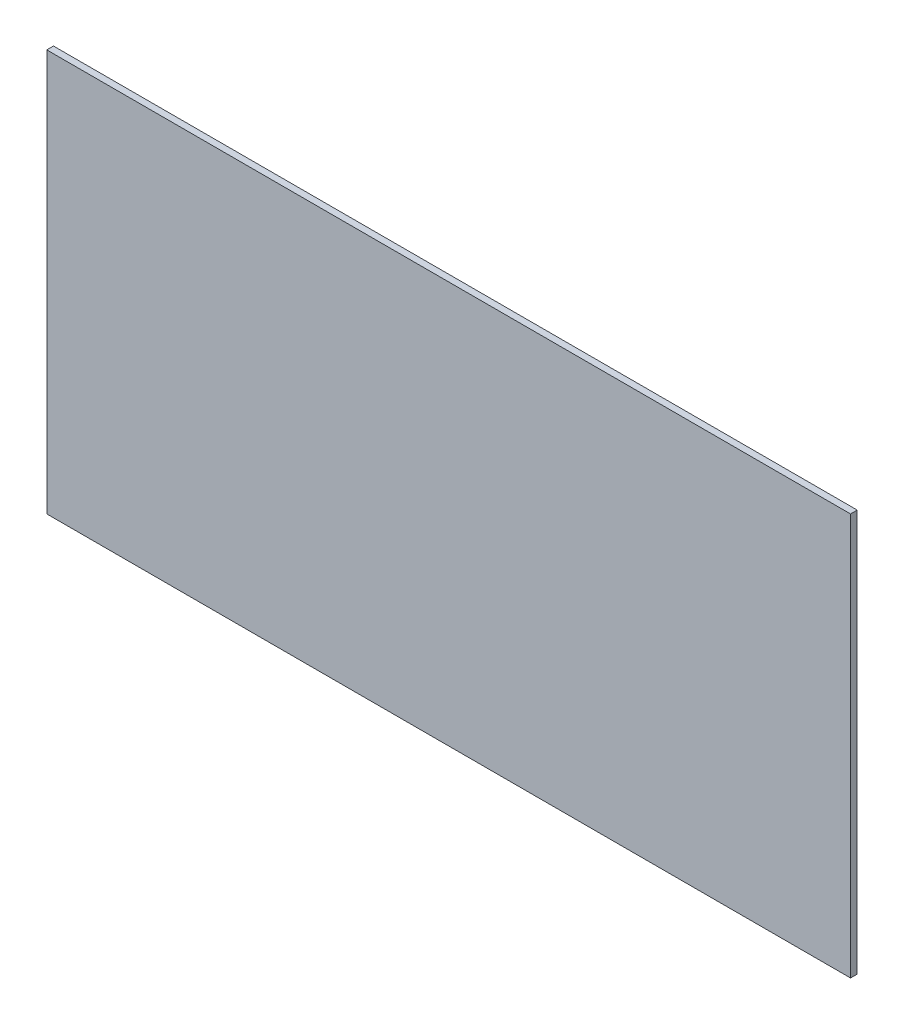
ISO-10303-21;
HEADER;
FILE_DESCRIPTION(('STEP AP214'),'2;1');
FILE_NAME('part.step','',(''),(''),'','','');
FILE_SCHEMA(('AUTOMOTIVE_DESIGN { 1 0 10303 214 1 1 1 1 }'));
ENDSEC;
DATA;
#1=APPLICATION_CONTEXT('core data for automotive mechanical design processes');
#2=APPLICATION_PROTOCOL_DEFINITION('international standard','automotive_design',2000,#1);
#3=PRODUCT_CONTEXT('',#1,'mechanical');
#4=PRODUCT('Part','Part','',(#3));
#5=PRODUCT_RELATED_PRODUCT_CATEGORY('part','',(#4));
#6=PRODUCT_DEFINITION_FORMATION('','',#4);
#7=PRODUCT_DEFINITION_CONTEXT('part definition',#1,'design');
#8=PRODUCT_DEFINITION('design','',#6,#7);
#9=PRODUCT_DEFINITION_SHAPE('','',#8);
#10=(LENGTH_UNIT() NAMED_UNIT(*) SI_UNIT(.MILLI.,.METRE.));
#11=(NAMED_UNIT(*) PLANE_ANGLE_UNIT() SI_UNIT($,.RADIAN.));
#12=(NAMED_UNIT(*) SI_UNIT($,.STERADIAN.) SOLID_ANGLE_UNIT());
#13=UNCERTAINTY_MEASURE_WITH_UNIT(LENGTH_MEASURE(1.E-05),#10,'distance_accuracy_value','');
#14=(GEOMETRIC_REPRESENTATION_CONTEXT(3) GLOBAL_UNCERTAINTY_ASSIGNED_CONTEXT((#13)) GLOBAL_UNIT_ASSIGNED_CONTEXT((#10,
#11,#12)) REPRESENTATION_CONTEXT('',''));
#15=CARTESIAN_POINT('',(0.,0.,0.));
#16=DIRECTION('',(0.,0.,1.));
#17=DIRECTION('',(1.,0.,0.));
#18=AXIS2_PLACEMENT_3D('',#15,#16,#17);
#19=CARTESIAN_POINT('',(304.8,0.,2.54));
#20=DIRECTION('',(0.,1.,0.));
#21=DIRECTION('',(0.,0.,1.));
#22=AXIS2_PLACEMENT_3D('',#19,#20,#21);
#23=PLANE('',#22);
#24=DIRECTION('',(1.,0.,0.));
#25=VECTOR('',#24,1.);
#26=CARTESIAN_POINT('',(304.8,0.,0.));
#27=LINE('',#26,#25);
#28=CARTESIAN_POINT('',(0.,0.,0.));
#29=VERTEX_POINT('',#28);
#30=CARTESIAN_POINT('',(304.8,0.,0.));
#31=VERTEX_POINT('',#30);
#32=EDGE_CURVE('E107',#29,#31,#27,.T.);
#33=ORIENTED_EDGE('',*,*,#32,.T.);
#34=DIRECTION('',(0.,0.,-1.));
#35=VECTOR('',#34,1.);
#36=CARTESIAN_POINT('',(304.8,0.,2.54));
#37=LINE('',#36,#35);
#38=CARTESIAN_POINT('',(304.8,0.,2.54));
#39=VERTEX_POINT('',#38);
#40=EDGE_CURVE('E11',#39,#31,#37,.T.);
#41=ORIENTED_EDGE('',*,*,#40,.F.);
#42=DIRECTION('',(1.,0.,0.));
#43=VECTOR('',#42,1.);
#44=CARTESIAN_POINT('',(304.8,0.,2.54));
#45=LINE('',#44,#43);
#46=CARTESIAN_POINT('',(0.,0.,2.54));
#47=VERTEX_POINT('',#46);
#48=EDGE_CURVE('E91',#47,#39,#45,.T.);
#49=ORIENTED_EDGE('',*,*,#48,.F.);
#50=DIRECTION('',(0.,0.,-1.));
#51=VECTOR('',#50,1.);
#52=CARTESIAN_POINT('',(0.,0.,2.54));
#53=LINE('',#52,#51);
#54=EDGE_CURVE('E103',#47,#29,#53,.T.);
#55=ORIENTED_EDGE('',*,*,#54,.T.);
#56=EDGE_LOOP('',(#33,#41,#49,#55));
#57=FACE_BOUND('',#56,.T.);
#58=ADVANCED_FACE('F39',(#57),#23,.F.);
#59=CARTESIAN_POINT('',(304.8,152.4,2.54));
#60=DIRECTION('',(-1.,0.,0.));
#61=DIRECTION('',(0.,0.,1.));
#62=AXIS2_PLACEMENT_3D('',#59,#60,#61);
#63=PLANE('',#62);
#64=DIRECTION('',(0.,1.,0.));
#65=VECTOR('',#64,1.);
#66=CARTESIAN_POINT('',(304.8,152.4,0.));
#67=LINE('',#66,#65);
#68=CARTESIAN_POINT('',(304.8,152.4,0.));
#69=VERTEX_POINT('',#68);
#70=EDGE_CURVE('E96',#31,#69,#67,.T.);
#71=ORIENTED_EDGE('',*,*,#70,.T.);
#72=DIRECTION('',(0.,0.,-1.));
#73=VECTOR('',#72,1.);
#74=CARTESIAN_POINT('',(304.8,152.4,2.54));
#75=LINE('',#74,#73);
#76=CARTESIAN_POINT('',(304.8,152.4,2.54));
#77=VERTEX_POINT('',#76);
#78=EDGE_CURVE('E48',#77,#69,#75,.T.);
#79=ORIENTED_EDGE('',*,*,#78,.F.);
#80=DIRECTION('',(0.,1.,0.));
#81=VECTOR('',#80,1.);
#82=CARTESIAN_POINT('',(304.8,152.4,2.54));
#83=LINE('',#82,#81);
#84=EDGE_CURVE('E86',#39,#77,#83,.T.);
#85=ORIENTED_EDGE('',*,*,#84,.F.);
#86=ORIENTED_EDGE('',*,*,#40,.T.);
#87=EDGE_LOOP('',(#71,#79,#85,#86));
#88=FACE_BOUND('',#87,.T.);
#89=ADVANCED_FACE('F95',(#88),#63,.F.);
#90=CARTESIAN_POINT('',(0.,152.4,2.54));
#91=DIRECTION('',(0.,-1.,0.));
#92=DIRECTION('',(0.,0.,-1.));
#93=AXIS2_PLACEMENT_3D('',#90,#91,#92);
#94=PLANE('',#93);
#95=DIRECTION('',(-1.,0.,0.));
#96=VECTOR('',#95,1.);
#97=CARTESIAN_POINT('',(0.,152.4,0.));
#98=LINE('',#97,#96);
#99=CARTESIAN_POINT('',(0.,152.4,0.));
#100=VERTEX_POINT('',#99);
#101=EDGE_CURVE('E73',#69,#100,#98,.T.);
#102=ORIENTED_EDGE('',*,*,#101,.T.);
#103=DIRECTION('',(0.,0.,-1.));
#104=VECTOR('',#103,1.);
#105=CARTESIAN_POINT('',(0.,152.4,2.54));
#106=LINE('',#105,#104);
#107=CARTESIAN_POINT('',(0.,152.4,2.54));
#108=VERTEX_POINT('',#107);
#109=EDGE_CURVE('E98',#108,#100,#106,.T.);
#110=ORIENTED_EDGE('',*,*,#109,.F.);
#111=DIRECTION('',(-1.,0.,0.));
#112=VECTOR('',#111,1.);
#113=CARTESIAN_POINT('',(0.,152.4,2.54));
#114=LINE('',#113,#112);
#115=EDGE_CURVE('E89',#77,#108,#114,.T.);
#116=ORIENTED_EDGE('',*,*,#115,.F.);
#117=ORIENTED_EDGE('',*,*,#78,.T.);
#118=EDGE_LOOP('',(#102,#110,#116,#117));
#119=FACE_BOUND('',#118,.T.);
#120=ADVANCED_FACE('F99',(#119),#94,.F.);
#121=CARTESIAN_POINT('',(0.,0.,2.54));
#122=DIRECTION('',(1.,0.,0.));
#123=DIRECTION('',(0.,0.,-1.));
#124=AXIS2_PLACEMENT_3D('',#121,#122,#123);
#125=PLANE('',#124);
#126=DIRECTION('',(0.,-1.,0.));
#127=VECTOR('',#126,1.);
#128=CARTESIAN_POINT('',(0.,0.,0.));
#129=LINE('',#128,#127);
#130=EDGE_CURVE('E79',#100,#29,#129,.T.);
#131=ORIENTED_EDGE('',*,*,#130,.T.);
#132=ORIENTED_EDGE('',*,*,#54,.F.);
#133=DIRECTION('',(0.,-1.,0.));
#134=VECTOR('',#133,1.);
#135=CARTESIAN_POINT('',(0.,0.,2.54));
#136=LINE('',#135,#134);
#137=EDGE_CURVE('E56',#108,#47,#136,.T.);
#138=ORIENTED_EDGE('',*,*,#137,.F.);
#139=ORIENTED_EDGE('',*,*,#109,.T.);
#140=EDGE_LOOP('',(#131,#132,#138,#139));
#141=FACE_BOUND('',#140,.T.);
#142=ADVANCED_FACE('F120',(#141),#125,.F.);
#143=CARTESIAN_POINT('',(0.,0.,2.54));
#144=DIRECTION('',(0.,0.,-1.));
#145=DIRECTION('',(-1.,0.,0.));
#146=AXIS2_PLACEMENT_3D('',#143,#144,#145);
#147=PLANE('',#146);
#148=ORIENTED_EDGE('',*,*,#48,.T.);
#149=ORIENTED_EDGE('',*,*,#84,.T.);
#150=ORIENTED_EDGE('',*,*,#115,.T.);
#151=ORIENTED_EDGE('',*,*,#137,.T.);
#152=EDGE_LOOP('',(#148,#149,#150,#151));
#153=FACE_BOUND('',#152,.T.);
#154=ADVANCED_FACE('F87',(#153),#147,.F.);
#155=CARTESIAN_POINT('',(0.,0.,0.));
#156=DIRECTION('',(0.,0.,-1.));
#157=DIRECTION('',(-1.,0.,0.));
#158=AXIS2_PLACEMENT_3D('',#155,#156,#157);
#159=PLANE('',#158);
#160=ORIENTED_EDGE('',*,*,#32,.F.);
#161=ORIENTED_EDGE('',*,*,#130,.F.);
#162=ORIENTED_EDGE('',*,*,#101,.F.);
#163=ORIENTED_EDGE('',*,*,#70,.F.);
#164=EDGE_LOOP('',(#160,#161,#162,#163));
#165=FACE_BOUND('',#164,.T.);
#166=ADVANCED_FACE('F123',(#165),#159,.T.);
#167=CLOSED_SHELL('',(#58,#89,#120,#142,#154,#166));
#168=MANIFOLD_SOLID_BREP('B2',#167);
#169=ADVANCED_BREP_SHAPE_REPRESENTATION('',(#18,#168),#14);
#170=SHAPE_DEFINITION_REPRESENTATION(#9,#169);
ENDSEC;
END-ISO-10303-21;
